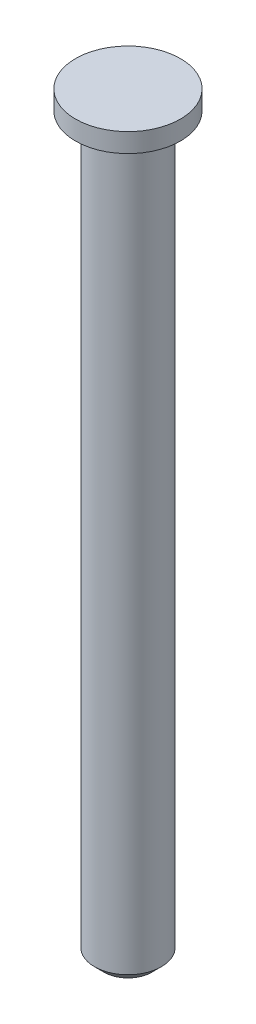
ISO-10303-21;
HEADER;
FILE_DESCRIPTION(('STEP AP214'),'2;1');
FILE_NAME('part.step','',(''),(''),'','','');
FILE_SCHEMA(('AUTOMOTIVE_DESIGN { 1 0 10303 214 1 1 1 1 }'));
ENDSEC;
DATA;
#1=APPLICATION_CONTEXT('core data for automotive mechanical design processes');
#2=APPLICATION_PROTOCOL_DEFINITION('international standard','automotive_design',2000,#1);
#3=PRODUCT_CONTEXT('',#1,'mechanical');
#4=PRODUCT('Part','Part','',(#3));
#5=PRODUCT_RELATED_PRODUCT_CATEGORY('part','',(#4));
#6=PRODUCT_DEFINITION_FORMATION('','',#4);
#7=PRODUCT_DEFINITION_CONTEXT('part definition',#1,'design');
#8=PRODUCT_DEFINITION('design','',#6,#7);
#9=PRODUCT_DEFINITION_SHAPE('','',#8);
#10=(LENGTH_UNIT() NAMED_UNIT(*) SI_UNIT(.MILLI.,.METRE.));
#11=(NAMED_UNIT(*) PLANE_ANGLE_UNIT() SI_UNIT($,.RADIAN.));
#12=(NAMED_UNIT(*) SI_UNIT($,.STERADIAN.) SOLID_ANGLE_UNIT());
#13=UNCERTAINTY_MEASURE_WITH_UNIT(LENGTH_MEASURE(1.E-05),#10,'distance_accuracy_value','');
#14=(GEOMETRIC_REPRESENTATION_CONTEXT(3) GLOBAL_UNCERTAINTY_ASSIGNED_CONTEXT((#13)) GLOBAL_UNIT_ASSIGNED_CONTEXT((#10,
#11,#12)) REPRESENTATION_CONTEXT('',''));
#15=CARTESIAN_POINT('',(0.,0.,0.));
#16=DIRECTION('',(0.,0.,1.));
#17=DIRECTION('',(1.,0.,0.));
#18=AXIS2_PLACEMENT_3D('',#15,#16,#17);
#19=CARTESIAN_POINT('',(2.22044604925031E-13,39.5,-3.88578058618805E-13));
#20=DIRECTION('',(0.,1.,0.));
#21=DIRECTION('',(0.,0.,1.));
#22=AXIS2_PLACEMENT_3D('',#19,#20,#21);
#23=PLANE('',#22);
#24=CARTESIAN_POINT('',(2.22044604925031E-13,39.5,-3.88578058618805E-13));
#25=DIRECTION('',(0.,1.,0.));
#26=DIRECTION('',(0.,0.,1.));
#27=AXIS2_PLACEMENT_3D('',#24,#25,#26);
#28=CIRCLE('',#27,5.5);
#29=CARTESIAN_POINT('',(2.22044604925031E-13,39.5,5.49999999999961));
#30=VERTEX_POINT('',#29);
#31=EDGE_CURVE('E45',#30,#30,#28,.T.);
#32=ORIENTED_EDGE('',*,*,#31,.T.);
#33=EDGE_LOOP('',(#32));
#34=FACE_BOUND('',#33,.T.);
#35=ADVANCED_FACE('F34',(#34),#23,.T.);
#36=CARTESIAN_POINT('',(0.,68.7168117519043,0.));
#37=DIRECTION('',(0.,1.,0.));
#38=DIRECTION('',(0.,0.,1.));
#39=AXIS2_PLACEMENT_3D('',#36,#37,#38);
#40=CYLINDRICAL_SURFACE('',#39,5.5);
#41=CARTESIAN_POINT('',(0.,37.5,0.));
#42=DIRECTION('',(0.,1.,0.));
#43=DIRECTION('',(0.,0.,1.));
#44=AXIS2_PLACEMENT_3D('',#41,#42,#43);
#45=CIRCLE('',#44,5.5);
#46=CARTESIAN_POINT('',(0.,37.5,5.5));
#47=VERTEX_POINT('',#46);
#48=EDGE_CURVE('E49',#47,#47,#45,.T.);
#49=ORIENTED_EDGE('',*,*,#48,.T.);
#50=EDGE_LOOP('',(#49));
#51=FACE_BOUND('',#50,.T.);
#52=ORIENTED_EDGE('',*,*,#31,.F.);
#53=EDGE_LOOP('',(#52));
#54=FACE_BOUND('',#53,.T.);
#55=ADVANCED_FACE('F70',(#51,#54),#40,.T.);
#56=CARTESIAN_POINT('',(-5.49999999999962,37.5,9.99200722162641E-13));
#57=DIRECTION('',(0.,-1.,0.));
#58=DIRECTION('',(0.,0.,-1.));
#59=AXIS2_PLACEMENT_3D('',#56,#57,#58);
#60=PLANE('',#59);
#61=CARTESIAN_POINT('',(0.,37.5,0.));
#62=DIRECTION('',(0.,1.,0.));
#63=DIRECTION('',(0.,0.,1.));
#64=AXIS2_PLACEMENT_3D('',#61,#62,#63);
#65=CIRCLE('',#64,3.50000000000001);
#66=CARTESIAN_POINT('',(0.,37.5,3.50000000000001));
#67=VERTEX_POINT('',#66);
#68=EDGE_CURVE('E54',#67,#67,#65,.T.);
#69=ORIENTED_EDGE('',*,*,#68,.T.);
#70=EDGE_LOOP('',(#69));
#71=FACE_BOUND('',#70,.T.);
#72=ORIENTED_EDGE('',*,*,#48,.F.);
#73=EDGE_LOOP('',(#72));
#74=FACE_BOUND('',#73,.T.);
#75=ADVANCED_FACE('F58',(#71,#74),#60,.T.);
#76=CARTESIAN_POINT('',(0.,68.7168117519043,0.));
#77=DIRECTION('',(0.,1.,0.));
#78=DIRECTION('',(0.,0.,1.));
#79=AXIS2_PLACEMENT_3D('',#76,#77,#78);
#80=CYLINDRICAL_SURFACE('',#79,3.5);
#81=CARTESIAN_POINT('',(2.22044604925031E-13,-38.5,-1.11022302462516E-13));
#82=DIRECTION('',(0.,-1.,0.));
#83=DIRECTION('',(0.,0.,-1.));
#84=AXIS2_PLACEMENT_3D('',#81,#82,#83);
#85=CIRCLE('',#84,3.5);
#86=CARTESIAN_POINT('',(2.22044604925031E-13,-38.5,-3.50000000000011));
#87=VERTEX_POINT('',#86);
#88=EDGE_CURVE('E41',#87,#87,#85,.F.);
#89=ORIENTED_EDGE('',*,*,#88,.T.);
#90=EDGE_LOOP('',(#89));
#91=FACE_BOUND('',#90,.T.);
#92=ORIENTED_EDGE('',*,*,#68,.F.);
#93=EDGE_LOOP('',(#92));
#94=FACE_BOUND('',#93,.T.);
#95=ADVANCED_FACE('F61',(#91,#94),#80,.T.);
#96=CARTESIAN_POINT('',(-3.50000000000272,-39.5,-4.9960036108132E-13));
#97=DIRECTION('',(0.,-1.,0.));
#98=DIRECTION('',(0.,0.,-1.));
#99=AXIS2_PLACEMENT_3D('',#96,#97,#98);
#100=PLANE('',#99);
#101=CARTESIAN_POINT('',(2.22044604925031E-13,-39.5,-1.11022302462516E-13));
#102=DIRECTION('',(0.,-1.,0.));
#103=DIRECTION('',(0.,0.,-1.));
#104=AXIS2_PLACEMENT_3D('',#101,#102,#103);
#105=CIRCLE('',#104,2.5);
#106=CARTESIAN_POINT('',(2.22044604925031E-13,-39.5,-2.50000000000011));
#107=VERTEX_POINT('',#106);
#108=EDGE_CURVE('E10',#107,#107,#105,.T.);
#109=ORIENTED_EDGE('',*,*,#108,.T.);
#110=EDGE_LOOP('',(#109));
#111=FACE_BOUND('',#110,.T.);
#112=ADVANCED_FACE('F63',(#111),#100,.T.);
#113=CARTESIAN_POINT('',(2.22044604925031E-13,-38.5,-1.11022302462516E-13));
#114=DIRECTION('',(0.,1.,0.));
#115=DIRECTION('',(0.,0.,1.));
#116=AXIS2_PLACEMENT_3D('',#113,#114,#115);
#117=CONICAL_SURFACE('',#116,3.5,0.785398163397452);
#118=ORIENTED_EDGE('',*,*,#108,.F.);
#119=EDGE_LOOP('',(#118));
#120=FACE_BOUND('',#119,.T.);
#121=ORIENTED_EDGE('',*,*,#88,.F.);
#122=EDGE_LOOP('',(#121));
#123=FACE_BOUND('',#122,.T.);
#124=ADVANCED_FACE('F36',(#120,#123),#117,.T.);
#125=CLOSED_SHELL('',(#35,#55,#75,#95,#112,#124));
#126=MANIFOLD_SOLID_BREP('B2',#125);
#127=ADVANCED_BREP_SHAPE_REPRESENTATION('',(#18,#126),#14);
#128=SHAPE_DEFINITION_REPRESENTATION(#9,#127);
ENDSEC;
END-ISO-10303-21;
